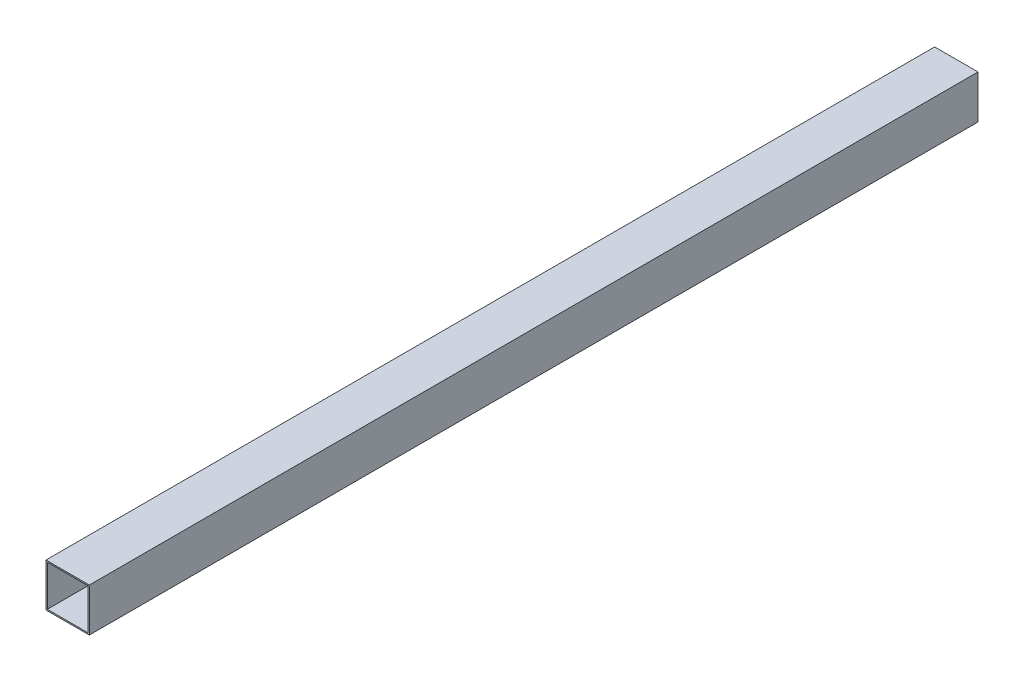
ISO-10303-21;
HEADER;
FILE_DESCRIPTION(('STEP AP214'),'2;1');
FILE_NAME('part.step','',(''),(''),'','','');
FILE_SCHEMA(('AUTOMOTIVE_DESIGN { 1 0 10303 214 1 1 1 1 }'));
ENDSEC;
DATA;
#1=APPLICATION_CONTEXT('core data for automotive mechanical design processes');
#2=APPLICATION_PROTOCOL_DEFINITION('international standard','automotive_design',2000,#1);
#3=PRODUCT_CONTEXT('',#1,'mechanical');
#4=PRODUCT('Part','Part','',(#3));
#5=PRODUCT_RELATED_PRODUCT_CATEGORY('part','',(#4));
#6=PRODUCT_DEFINITION_FORMATION('','',#4);
#7=PRODUCT_DEFINITION_CONTEXT('part definition',#1,'design');
#8=PRODUCT_DEFINITION('design','',#6,#7);
#9=PRODUCT_DEFINITION_SHAPE('','',#8);
#10=(LENGTH_UNIT() NAMED_UNIT(*) SI_UNIT(.MILLI.,.METRE.));
#11=(NAMED_UNIT(*) PLANE_ANGLE_UNIT() SI_UNIT($,.RADIAN.));
#12=(NAMED_UNIT(*) SI_UNIT($,.STERADIAN.) SOLID_ANGLE_UNIT());
#13=UNCERTAINTY_MEASURE_WITH_UNIT(LENGTH_MEASURE(1.E-05),#10,'distance_accuracy_value','');
#14=(GEOMETRIC_REPRESENTATION_CONTEXT(3) GLOBAL_UNCERTAINTY_ASSIGNED_CONTEXT((#13)) GLOBAL_UNIT_ASSIGNED_CONTEXT((#10,
#11,#12)) REPRESENTATION_CONTEXT('',''));
#15=CARTESIAN_POINT('',(0.,0.,0.));
#16=DIRECTION('',(0.,0.,1.));
#17=DIRECTION('',(1.,0.,0.));
#18=AXIS2_PLACEMENT_3D('',#15,#16,#17);
#19=CARTESIAN_POINT('',(0.,0.,820.));
#20=DIRECTION('',(0.,0.,-1.));
#21=DIRECTION('',(-1.,0.,0.));
#22=AXIS2_PLACEMENT_3D('',#19,#20,#21);
#23=PLANE('',#22);
#24=DIRECTION('',(0.,1.,0.));
#25=VECTOR('',#24,1.);
#26=CARTESIAN_POINT('',(20.,-20.,820.));
#27=LINE('',#26,#25);
#28=CARTESIAN_POINT('',(20.,-20.,820.));
#29=VERTEX_POINT('',#28);
#30=CARTESIAN_POINT('',(20.,20.,820.));
#31=VERTEX_POINT('',#30);
#32=EDGE_CURVE('E136',#29,#31,#27,.T.);
#33=ORIENTED_EDGE('',*,*,#32,.T.);
#34=DIRECTION('',(-1.,0.,0.));
#35=VECTOR('',#34,1.);
#36=CARTESIAN_POINT('',(-20.,20.,820.));
#37=LINE('',#36,#35);
#38=CARTESIAN_POINT('',(-20.,20.,820.));
#39=VERTEX_POINT('',#38);
#40=EDGE_CURVE('E139',#31,#39,#37,.T.);
#41=ORIENTED_EDGE('',*,*,#40,.T.);
#42=DIRECTION('',(0.,-1.,0.));
#43=VECTOR('',#42,1.);
#44=CARTESIAN_POINT('',(-20.,-20.,820.));
#45=LINE('',#44,#43);
#46=CARTESIAN_POINT('',(-20.,-20.,820.));
#47=VERTEX_POINT('',#46);
#48=EDGE_CURVE('E142',#39,#47,#45,.T.);
#49=ORIENTED_EDGE('',*,*,#48,.T.);
#50=DIRECTION('',(1.,0.,0.));
#51=VECTOR('',#50,1.);
#52=CARTESIAN_POINT('',(-20.,-20.,820.));
#53=LINE('',#52,#51);
#54=EDGE_CURVE('E144',#47,#29,#53,.T.);
#55=ORIENTED_EDGE('',*,*,#54,.T.);
#56=EDGE_LOOP('',(#33,#41,#49,#55));
#57=FACE_BOUND('',#56,.T.);
#58=DIRECTION('',(0.,-1.,0.));
#59=VECTOR('',#58,1.);
#60=CARTESIAN_POINT('',(-18.8,-18.8,820.));
#61=LINE('',#60,#59);
#62=CARTESIAN_POINT('',(-18.8,18.8,820.));
#63=VERTEX_POINT('',#62);
#64=CARTESIAN_POINT('',(-18.8,-18.8,820.));
#65=VERTEX_POINT('',#64);
#66=EDGE_CURVE('E100',#63,#65,#61,.T.);
#67=ORIENTED_EDGE('',*,*,#66,.F.);
#68=DIRECTION('',(-1.,0.,0.));
#69=VECTOR('',#68,1.);
#70=CARTESIAN_POINT('',(-18.8,18.8,820.));
#71=LINE('',#70,#69);
#72=CARTESIAN_POINT('',(18.8,18.8,820.));
#73=VERTEX_POINT('',#72);
#74=EDGE_CURVE('E122',#73,#63,#71,.T.);
#75=ORIENTED_EDGE('',*,*,#74,.F.);
#76=DIRECTION('',(0.,1.,0.));
#77=VECTOR('',#76,1.);
#78=CARTESIAN_POINT('',(18.8,-18.8,820.));
#79=LINE('',#78,#77);
#80=CARTESIAN_POINT('',(18.8,-18.8,820.));
#81=VERTEX_POINT('',#80);
#82=EDGE_CURVE('E120',#81,#73,#79,.T.);
#83=ORIENTED_EDGE('',*,*,#82,.F.);
#84=DIRECTION('',(1.,0.,0.));
#85=VECTOR('',#84,1.);
#86=CARTESIAN_POINT('',(-18.8,-18.8,820.));
#87=LINE('',#86,#85);
#88=EDGE_CURVE('E108',#65,#81,#87,.T.);
#89=ORIENTED_EDGE('',*,*,#88,.F.);
#90=EDGE_LOOP('',(#67,#75,#83,#89));
#91=FACE_BOUND('',#90,.T.);
#92=ADVANCED_FACE('F35',(#57,#91),#23,.F.);
#93=CARTESIAN_POINT('',(0.,0.,0.));
#94=DIRECTION('',(0.,0.,-1.));
#95=DIRECTION('',(-1.,0.,0.));
#96=AXIS2_PLACEMENT_3D('',#93,#94,#95);
#97=PLANE('',#96);
#98=DIRECTION('',(0.,1.,0.));
#99=VECTOR('',#98,1.);
#100=CARTESIAN_POINT('',(20.,-20.,0.));
#101=LINE('',#100,#99);
#102=CARTESIAN_POINT('',(20.,-20.,0.));
#103=VERTEX_POINT('',#102);
#104=CARTESIAN_POINT('',(20.,20.,0.));
#105=VERTEX_POINT('',#104);
#106=EDGE_CURVE('E116',#103,#105,#101,.T.);
#107=ORIENTED_EDGE('',*,*,#106,.F.);
#108=DIRECTION('',(1.,0.,0.));
#109=VECTOR('',#108,1.);
#110=CARTESIAN_POINT('',(-20.,-20.,0.));
#111=LINE('',#110,#109);
#112=CARTESIAN_POINT('',(-20.,-20.,0.));
#113=VERTEX_POINT('',#112);
#114=EDGE_CURVE('E140',#113,#103,#111,.T.);
#115=ORIENTED_EDGE('',*,*,#114,.F.);
#116=DIRECTION('',(0.,-1.,0.));
#117=VECTOR('',#116,1.);
#118=CARTESIAN_POINT('',(-20.,-20.,0.));
#119=LINE('',#118,#117);
#120=CARTESIAN_POINT('',(-20.,20.,0.));
#121=VERTEX_POINT('',#120);
#122=EDGE_CURVE('E151',#121,#113,#119,.T.);
#123=ORIENTED_EDGE('',*,*,#122,.F.);
#124=DIRECTION('',(-1.,0.,0.));
#125=VECTOR('',#124,1.);
#126=CARTESIAN_POINT('',(-20.,20.,0.));
#127=LINE('',#126,#125);
#128=EDGE_CURVE('E149',#105,#121,#127,.T.);
#129=ORIENTED_EDGE('',*,*,#128,.F.);
#130=EDGE_LOOP('',(#107,#115,#123,#129));
#131=FACE_BOUND('',#130,.T.);
#132=DIRECTION('',(-1.,0.,0.));
#133=VECTOR('',#132,1.);
#134=CARTESIAN_POINT('',(-18.8,18.8,0.));
#135=LINE('',#134,#133);
#136=CARTESIAN_POINT('',(18.8,18.8,0.));
#137=VERTEX_POINT('',#136);
#138=CARTESIAN_POINT('',(-18.8,18.8,0.));
#139=VERTEX_POINT('',#138);
#140=EDGE_CURVE('E109',#137,#139,#135,.T.);
#141=ORIENTED_EDGE('',*,*,#140,.T.);
#142=DIRECTION('',(0.,-1.,0.));
#143=VECTOR('',#142,1.);
#144=CARTESIAN_POINT('',(-18.8,-18.8,0.));
#145=LINE('',#144,#143);
#146=CARTESIAN_POINT('',(-18.8,-18.8,0.));
#147=VERTEX_POINT('',#146);
#148=EDGE_CURVE('E58',#139,#147,#145,.T.);
#149=ORIENTED_EDGE('',*,*,#148,.T.);
#150=DIRECTION('',(1.,0.,0.));
#151=VECTOR('',#150,1.);
#152=CARTESIAN_POINT('',(-18.8,-18.8,0.));
#153=LINE('',#152,#151);
#154=CARTESIAN_POINT('',(18.8,-18.8,0.));
#155=VERTEX_POINT('',#154);
#156=EDGE_CURVE('E115',#147,#155,#153,.T.);
#157=ORIENTED_EDGE('',*,*,#156,.T.);
#158=DIRECTION('',(0.,1.,0.));
#159=VECTOR('',#158,1.);
#160=CARTESIAN_POINT('',(18.8,-18.8,0.));
#161=LINE('',#160,#159);
#162=EDGE_CURVE('E128',#155,#137,#161,.T.);
#163=ORIENTED_EDGE('',*,*,#162,.T.);
#164=EDGE_LOOP('',(#141,#149,#157,#163));
#165=FACE_BOUND('',#164,.T.);
#166=ADVANCED_FACE('F169',(#131,#165),#97,.T.);
#167=CARTESIAN_POINT('',(20.,-20.,820.));
#168=DIRECTION('',(-1.,0.,0.));
#169=DIRECTION('',(0.,0.,1.));
#170=AXIS2_PLACEMENT_3D('',#167,#168,#169);
#171=PLANE('',#170);
#172=ORIENTED_EDGE('',*,*,#106,.T.);
#173=DIRECTION('',(0.,0.,-1.));
#174=VECTOR('',#173,1.);
#175=CARTESIAN_POINT('',(20.,20.,820.));
#176=LINE('',#175,#174);
#177=EDGE_CURVE('E11',#31,#105,#176,.T.);
#178=ORIENTED_EDGE('',*,*,#177,.F.);
#179=ORIENTED_EDGE('',*,*,#32,.F.);
#180=DIRECTION('',(0.,0.,-1.));
#181=VECTOR('',#180,1.);
#182=CARTESIAN_POINT('',(20.,-20.,820.));
#183=LINE('',#182,#181);
#184=EDGE_CURVE('E146',#29,#103,#183,.T.);
#185=ORIENTED_EDGE('',*,*,#184,.T.);
#186=EDGE_LOOP('',(#172,#178,#179,#185));
#187=FACE_BOUND('',#186,.T.);
#188=ADVANCED_FACE('F37',(#187),#171,.F.);
#189=CARTESIAN_POINT('',(-20.,20.,820.));
#190=DIRECTION('',(0.,-1.,0.));
#191=DIRECTION('',(0.,0.,-1.));
#192=AXIS2_PLACEMENT_3D('',#189,#190,#191);
#193=PLANE('',#192);
#194=ORIENTED_EDGE('',*,*,#128,.T.);
#195=DIRECTION('',(0.,0.,-1.));
#196=VECTOR('',#195,1.);
#197=CARTESIAN_POINT('',(-20.,20.,820.));
#198=LINE('',#197,#196);
#199=EDGE_CURVE('E43',#39,#121,#198,.T.);
#200=ORIENTED_EDGE('',*,*,#199,.F.);
#201=ORIENTED_EDGE('',*,*,#40,.F.);
#202=ORIENTED_EDGE('',*,*,#177,.T.);
#203=EDGE_LOOP('',(#194,#200,#201,#202));
#204=FACE_BOUND('',#203,.T.);
#205=ADVANCED_FACE('F179',(#204),#193,.F.);
#206=CARTESIAN_POINT('',(-20.,-20.,820.));
#207=DIRECTION('',(1.,0.,0.));
#208=DIRECTION('',(0.,0.,-1.));
#209=AXIS2_PLACEMENT_3D('',#206,#207,#208);
#210=PLANE('',#209);
#211=ORIENTED_EDGE('',*,*,#122,.T.);
#212=DIRECTION('',(0.,0.,-1.));
#213=VECTOR('',#212,1.);
#214=CARTESIAN_POINT('',(-20.,-20.,820.));
#215=LINE('',#214,#213);
#216=EDGE_CURVE('E156',#47,#113,#215,.T.);
#217=ORIENTED_EDGE('',*,*,#216,.F.);
#218=ORIENTED_EDGE('',*,*,#48,.F.);
#219=ORIENTED_EDGE('',*,*,#199,.T.);
#220=EDGE_LOOP('',(#211,#217,#218,#219));
#221=FACE_BOUND('',#220,.T.);
#222=ADVANCED_FACE('F163',(#221),#210,.F.);
#223=CARTESIAN_POINT('',(-20.,-20.,820.));
#224=DIRECTION('',(0.,1.,0.));
#225=DIRECTION('',(0.,0.,1.));
#226=AXIS2_PLACEMENT_3D('',#223,#224,#225);
#227=PLANE('',#226);
#228=ORIENTED_EDGE('',*,*,#114,.T.);
#229=ORIENTED_EDGE('',*,*,#184,.F.);
#230=ORIENTED_EDGE('',*,*,#54,.F.);
#231=ORIENTED_EDGE('',*,*,#216,.T.);
#232=EDGE_LOOP('',(#228,#229,#230,#231));
#233=FACE_BOUND('',#232,.T.);
#234=ADVANCED_FACE('F173',(#233),#227,.F.);
#235=CARTESIAN_POINT('',(-18.8,-18.8,820.));
#236=DIRECTION('',(1.,0.,0.));
#237=DIRECTION('',(0.,0.,-1.));
#238=AXIS2_PLACEMENT_3D('',#235,#236,#237);
#239=PLANE('',#238);
#240=ORIENTED_EDGE('',*,*,#148,.F.);
#241=DIRECTION('',(0.,0.,-1.));
#242=VECTOR('',#241,1.);
#243=CARTESIAN_POINT('',(-18.8,18.8,820.));
#244=LINE('',#243,#242);
#245=EDGE_CURVE('E104',#63,#139,#244,.T.);
#246=ORIENTED_EDGE('',*,*,#245,.F.);
#247=ORIENTED_EDGE('',*,*,#66,.T.);
#248=DIRECTION('',(0.,0.,-1.));
#249=VECTOR('',#248,1.);
#250=CARTESIAN_POINT('',(-18.8,-18.8,820.));
#251=LINE('',#250,#249);
#252=EDGE_CURVE('E103',#65,#147,#251,.T.);
#253=ORIENTED_EDGE('',*,*,#252,.T.);
#254=EDGE_LOOP('',(#240,#246,#247,#253));
#255=FACE_BOUND('',#254,.T.);
#256=ADVANCED_FACE('F102',(#255),#239,.T.);
#257=CARTESIAN_POINT('',(-18.8,-18.8,820.));
#258=DIRECTION('',(0.,1.,0.));
#259=DIRECTION('',(0.,0.,1.));
#260=AXIS2_PLACEMENT_3D('',#257,#258,#259);
#261=PLANE('',#260);
#262=ORIENTED_EDGE('',*,*,#156,.F.);
#263=ORIENTED_EDGE('',*,*,#252,.F.);
#264=ORIENTED_EDGE('',*,*,#88,.T.);
#265=DIRECTION('',(0.,0.,-1.));
#266=VECTOR('',#265,1.);
#267=CARTESIAN_POINT('',(18.8,-18.8,820.));
#268=LINE('',#267,#266);
#269=EDGE_CURVE('E117',#81,#155,#268,.T.);
#270=ORIENTED_EDGE('',*,*,#269,.T.);
#271=EDGE_LOOP('',(#262,#263,#264,#270));
#272=FACE_BOUND('',#271,.T.);
#273=ADVANCED_FACE('F112',(#272),#261,.T.);
#274=CARTESIAN_POINT('',(18.8,-18.8,820.));
#275=DIRECTION('',(-1.,0.,0.));
#276=DIRECTION('',(0.,0.,1.));
#277=AXIS2_PLACEMENT_3D('',#274,#275,#276);
#278=PLANE('',#277);
#279=ORIENTED_EDGE('',*,*,#162,.F.);
#280=ORIENTED_EDGE('',*,*,#269,.F.);
#281=ORIENTED_EDGE('',*,*,#82,.T.);
#282=DIRECTION('',(0.,0.,-1.));
#283=VECTOR('',#282,1.);
#284=CARTESIAN_POINT('',(18.8,18.8,820.));
#285=LINE('',#284,#283);
#286=EDGE_CURVE('E50',#73,#137,#285,.T.);
#287=ORIENTED_EDGE('',*,*,#286,.T.);
#288=EDGE_LOOP('',(#279,#280,#281,#287));
#289=FACE_BOUND('',#288,.T.);
#290=ADVANCED_FACE('F202',(#289),#278,.T.);
#291=CARTESIAN_POINT('',(-18.8,18.8,820.));
#292=DIRECTION('',(0.,-1.,0.));
#293=DIRECTION('',(0.,0.,-1.));
#294=AXIS2_PLACEMENT_3D('',#291,#292,#293);
#295=PLANE('',#294);
#296=ORIENTED_EDGE('',*,*,#140,.F.);
#297=ORIENTED_EDGE('',*,*,#286,.F.);
#298=ORIENTED_EDGE('',*,*,#74,.T.);
#299=ORIENTED_EDGE('',*,*,#245,.T.);
#300=EDGE_LOOP('',(#296,#297,#298,#299));
#301=FACE_BOUND('',#300,.T.);
#302=ADVANCED_FACE('F206',(#301),#295,.T.);
#303=CLOSED_SHELL('',(#92,#166,#188,#205,#222,#234,#256,#273,#290,#302));
#304=MANIFOLD_SOLID_BREP('B2',#303);
#305=ADVANCED_BREP_SHAPE_REPRESENTATION('',(#18,#304),#14);
#306=SHAPE_DEFINITION_REPRESENTATION(#9,#305);
ENDSEC;
END-ISO-10303-21;
